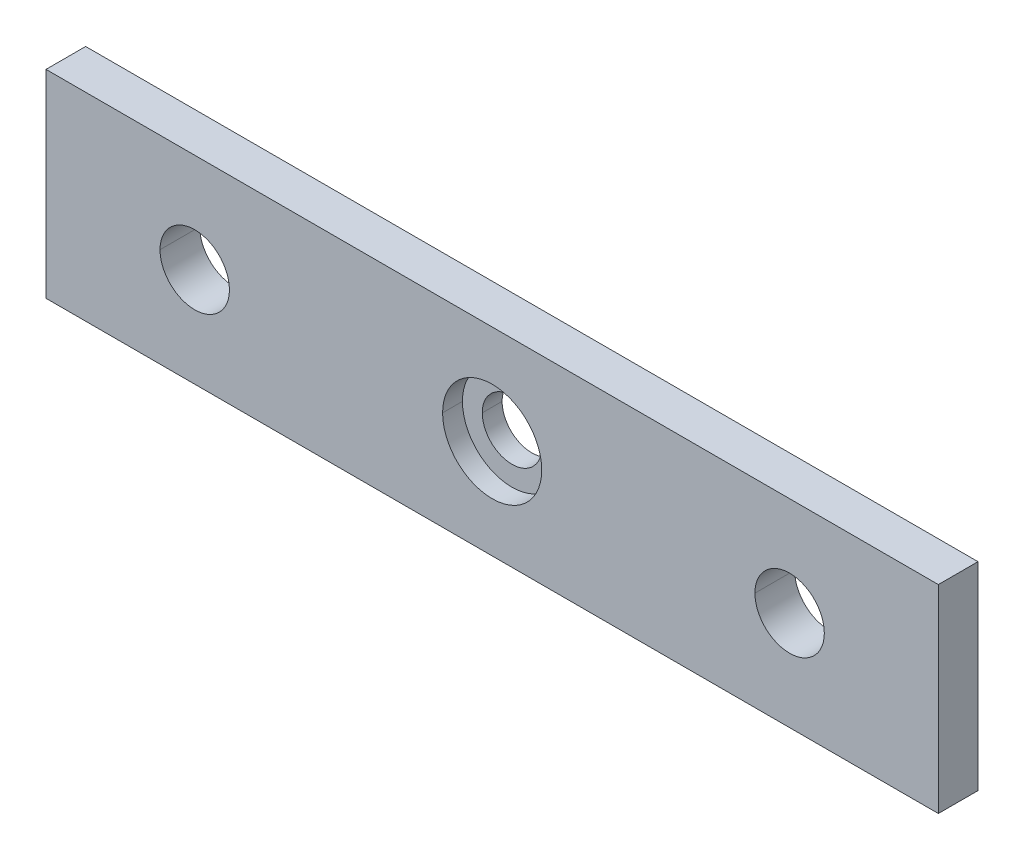
ISO-10303-21;
HEADER;
FILE_DESCRIPTION(('STEP AP214'),'2;1');
FILE_NAME('part.step','',(''),(''),'','','');
FILE_SCHEMA(('AUTOMOTIVE_DESIGN { 1 0 10303 214 1 1 1 1 }'));
ENDSEC;
DATA;
#1=APPLICATION_CONTEXT('core data for automotive mechanical design processes');
#2=APPLICATION_PROTOCOL_DEFINITION('international standard','automotive_design',2000,#1);
#3=PRODUCT_CONTEXT('',#1,'mechanical');
#4=PRODUCT('Part','Part','',(#3));
#5=PRODUCT_RELATED_PRODUCT_CATEGORY('part','',(#4));
#6=PRODUCT_DEFINITION_FORMATION('','',#4);
#7=PRODUCT_DEFINITION_CONTEXT('part definition',#1,'design');
#8=PRODUCT_DEFINITION('design','',#6,#7);
#9=PRODUCT_DEFINITION_SHAPE('','',#8);
#10=(LENGTH_UNIT() NAMED_UNIT(*) SI_UNIT(.MILLI.,.METRE.));
#11=(NAMED_UNIT(*) PLANE_ANGLE_UNIT() SI_UNIT($,.RADIAN.));
#12=(NAMED_UNIT(*) SI_UNIT($,.STERADIAN.) SOLID_ANGLE_UNIT());
#13=UNCERTAINTY_MEASURE_WITH_UNIT(LENGTH_MEASURE(1.E-05),#10,'distance_accuracy_value','');
#14=(GEOMETRIC_REPRESENTATION_CONTEXT(3) GLOBAL_UNCERTAINTY_ASSIGNED_CONTEXT((#13)) GLOBAL_UNIT_ASSIGNED_CONTEXT((#10,
#11,#12)) REPRESENTATION_CONTEXT('',''));
#15=CARTESIAN_POINT('',(0.,0.,0.));
#16=DIRECTION('',(0.,0.,1.));
#17=DIRECTION('',(1.,0.,0.));
#18=AXIS2_PLACEMENT_3D('',#15,#16,#17);
#19=CARTESIAN_POINT('',(22.5,5.,1.));
#20=DIRECTION('',(0.,0.,-1.));
#21=DIRECTION('',(-1.,0.,0.));
#22=AXIS2_PLACEMENT_3D('',#19,#20,#21);
#23=CYLINDRICAL_SURFACE('',#22,1.5);
#24=DIRECTION('',(0.,0.,-1.));
#25=VECTOR('',#24,1.);
#26=CARTESIAN_POINT('',(24.,5.,1.));
#27=LINE('',#26,#25);
#28=CARTESIAN_POINT('',(24.,5.,1.));
#29=VERTEX_POINT('',#28);
#30=CARTESIAN_POINT('',(24.,5.,0.));
#31=VERTEX_POINT('',#30);
#32=EDGE_CURVE('E213',#29,#31,#27,.T.);
#33=ORIENTED_EDGE('',*,*,#32,.F.);
#34=CARTESIAN_POINT('',(22.5,5.,1.));
#35=DIRECTION('',(0.,0.,-1.));
#36=DIRECTION('',(-1.,0.,0.));
#37=AXIS2_PLACEMENT_3D('',#34,#35,#36);
#38=CIRCLE('',#37,1.5);
#39=CARTESIAN_POINT('',(21.,5.,1.));
#40=VERTEX_POINT('',#39);
#41=EDGE_CURVE('E11',#40,#29,#38,.T.);
#42=ORIENTED_EDGE('',*,*,#41,.F.);
#43=DIRECTION('',(0.,0.,-1.));
#44=VECTOR('',#43,1.);
#45=CARTESIAN_POINT('',(21.,5.,1.));
#46=LINE('',#45,#44);
#47=CARTESIAN_POINT('',(21.,5.,0.));
#48=VERTEX_POINT('',#47);
#49=EDGE_CURVE('E216',#40,#48,#46,.T.);
#50=ORIENTED_EDGE('',*,*,#49,.T.);
#51=CARTESIAN_POINT('',(22.5,5.,0.));
#52=DIRECTION('',(0.,0.,-1.));
#53=DIRECTION('',(-1.,0.,0.));
#54=AXIS2_PLACEMENT_3D('',#51,#52,#53);
#55=CIRCLE('',#54,1.5);
#56=EDGE_CURVE('E21',#48,#31,#55,.T.);
#57=ORIENTED_EDGE('',*,*,#56,.T.);
#58=EDGE_LOOP('',(#33,#42,#50,#57));
#59=FACE_BOUND('',#58,.T.);
#60=ADVANCED_FACE('F17',(#59),#23,.F.);
#61=CARTESIAN_POINT('',(22.5,5.,1.));
#62=DIRECTION('',(0.,0.,-1.));
#63=DIRECTION('',(0.,-1.,0.));
#64=AXIS2_PLACEMENT_3D('',#61,#62,#63);
#65=PLANE('',#64);
#66=ORIENTED_EDGE('',*,*,#41,.T.);
#67=CARTESIAN_POINT('',(22.5,5.,1.));
#68=DIRECTION('',(0.,0.,-1.));
#69=DIRECTION('',(-1.,0.,0.));
#70=AXIS2_PLACEMENT_3D('',#67,#68,#69);
#71=CIRCLE('',#70,1.5);
#72=EDGE_CURVE('E209',#29,#40,#71,.T.);
#73=ORIENTED_EDGE('',*,*,#72,.T.);
#74=EDGE_LOOP('',(#66,#73));
#75=FACE_BOUND('',#74,.T.);
#76=CARTESIAN_POINT('',(22.5,5.,1.));
#77=DIRECTION('',(0.,0.,-1.));
#78=DIRECTION('',(-1.,0.,0.));
#79=AXIS2_PLACEMENT_3D('',#76,#77,#78);
#80=CIRCLE('',#79,2.5);
#81=CARTESIAN_POINT('',(20.,5.,1.));
#82=VERTEX_POINT('',#81);
#83=CARTESIAN_POINT('',(25.,5.,1.));
#84=VERTEX_POINT('',#83);
#85=EDGE_CURVE('E169',#82,#84,#80,.T.);
#86=ORIENTED_EDGE('',*,*,#85,.F.);
#87=CARTESIAN_POINT('',(22.5,5.,1.));
#88=DIRECTION('',(0.,0.,-1.));
#89=DIRECTION('',(-1.,0.,0.));
#90=AXIS2_PLACEMENT_3D('',#87,#88,#89);
#91=CIRCLE('',#90,2.5);
#92=EDGE_CURVE('E192',#84,#82,#91,.T.);
#93=ORIENTED_EDGE('',*,*,#92,.F.);
#94=EDGE_LOOP('',(#86,#93));
#95=FACE_BOUND('',#94,.T.);
#96=ADVANCED_FACE('F296',(#75,#95),#65,.F.);
#97=CARTESIAN_POINT('',(37.5,5.,2.));
#98=DIRECTION('',(0.,0.,-1.));
#99=DIRECTION('',(-1.,0.,0.));
#100=AXIS2_PLACEMENT_3D('',#97,#98,#99);
#101=CYLINDRICAL_SURFACE('',#100,1.75);
#102=DIRECTION('',(0.,0.,-1.));
#103=VECTOR('',#102,1.);
#104=CARTESIAN_POINT('',(39.25,5.,2.));
#105=LINE('',#104,#103);
#106=CARTESIAN_POINT('',(39.25,5.,2.));
#107=VERTEX_POINT('',#106);
#108=CARTESIAN_POINT('',(39.25,5.,0.));
#109=VERTEX_POINT('',#108);
#110=EDGE_CURVE('E147',#107,#109,#105,.T.);
#111=ORIENTED_EDGE('',*,*,#110,.F.);
#112=CARTESIAN_POINT('',(37.5,5.,2.));
#113=DIRECTION('',(0.,0.,1.));
#114=DIRECTION('',(1.,0.,0.));
#115=AXIS2_PLACEMENT_3D('',#112,#113,#114);
#116=CIRCLE('',#115,1.75);
#117=CARTESIAN_POINT('',(35.75,5.,2.));
#118=VERTEX_POINT('',#117);
#119=EDGE_CURVE('E139',#107,#118,#116,.T.);
#120=ORIENTED_EDGE('',*,*,#119,.T.);
#121=DIRECTION('',(0.,0.,-1.));
#122=VECTOR('',#121,1.);
#123=CARTESIAN_POINT('',(35.75,5.,2.));
#124=LINE('',#123,#122);
#125=CARTESIAN_POINT('',(35.75,5.,0.));
#126=VERTEX_POINT('',#125);
#127=EDGE_CURVE('E137',#118,#126,#124,.T.);
#128=ORIENTED_EDGE('',*,*,#127,.T.);
#129=CARTESIAN_POINT('',(37.5,5.,0.));
#130=DIRECTION('',(0.,0.,1.));
#131=DIRECTION('',(1.,0.,0.));
#132=AXIS2_PLACEMENT_3D('',#129,#130,#131);
#133=CIRCLE('',#132,1.75);
#134=EDGE_CURVE('E124',#109,#126,#133,.T.);
#135=ORIENTED_EDGE('',*,*,#134,.F.);
#136=EDGE_LOOP('',(#111,#120,#128,#135));
#137=FACE_BOUND('',#136,.T.);
#138=ADVANCED_FACE('F138',(#137),#101,.F.);
#139=CARTESIAN_POINT('',(7.5,5.,2.));
#140=DIRECTION('',(0.,0.,-1.));
#141=DIRECTION('',(-1.,0.,0.));
#142=AXIS2_PLACEMENT_3D('',#139,#140,#141);
#143=CYLINDRICAL_SURFACE('',#142,1.75);
#144=DIRECTION('',(0.,0.,-1.));
#145=VECTOR('',#144,1.);
#146=CARTESIAN_POINT('',(9.25,5.,2.));
#147=LINE('',#146,#145);
#148=CARTESIAN_POINT('',(9.25,5.,2.));
#149=VERTEX_POINT('',#148);
#150=CARTESIAN_POINT('',(9.25,5.,0.));
#151=VERTEX_POINT('',#150);
#152=EDGE_CURVE('E226',#149,#151,#147,.T.);
#153=ORIENTED_EDGE('',*,*,#152,.F.);
#154=CARTESIAN_POINT('',(7.5,5.,2.));
#155=DIRECTION('',(0.,0.,1.));
#156=DIRECTION('',(1.,0.,0.));
#157=AXIS2_PLACEMENT_3D('',#154,#155,#156);
#158=CIRCLE('',#157,1.75);
#159=CARTESIAN_POINT('',(5.75,5.,2.));
#160=VERTEX_POINT('',#159);
#161=EDGE_CURVE('E200',#149,#160,#158,.T.);
#162=ORIENTED_EDGE('',*,*,#161,.T.);
#163=DIRECTION('',(0.,0.,-1.));
#164=VECTOR('',#163,1.);
#165=CARTESIAN_POINT('',(5.75,5.,2.));
#166=LINE('',#165,#164);
#167=CARTESIAN_POINT('',(5.75,5.,0.));
#168=VERTEX_POINT('',#167);
#169=EDGE_CURVE('E181',#160,#168,#166,.T.);
#170=ORIENTED_EDGE('',*,*,#169,.T.);
#171=CARTESIAN_POINT('',(7.5,5.,0.));
#172=DIRECTION('',(0.,0.,1.));
#173=DIRECTION('',(1.,0.,0.));
#174=AXIS2_PLACEMENT_3D('',#171,#172,#173);
#175=CIRCLE('',#174,1.75);
#176=EDGE_CURVE('E134',#151,#168,#175,.T.);
#177=ORIENTED_EDGE('',*,*,#176,.F.);
#178=EDGE_LOOP('',(#153,#162,#170,#177));
#179=FACE_BOUND('',#178,.T.);
#180=ADVANCED_FACE('F268',(#179),#143,.F.);
#181=CARTESIAN_POINT('',(0.,10.,2.));
#182=DIRECTION('',(0.,-1.,0.));
#183=DIRECTION('',(0.,0.,-1.));
#184=AXIS2_PLACEMENT_3D('',#181,#182,#183);
#185=PLANE('',#184);
#186=DIRECTION('',(-1.,0.,0.));
#187=VECTOR('',#186,1.);
#188=CARTESIAN_POINT('',(0.,10.,0.));
#189=LINE('',#188,#187);
#190=CARTESIAN_POINT('',(45.,10.,0.));
#191=VERTEX_POINT('',#190);
#192=CARTESIAN_POINT('',(0.,10.,0.));
#193=VERTEX_POINT('',#192);
#194=EDGE_CURVE('E162',#191,#193,#189,.T.);
#195=ORIENTED_EDGE('',*,*,#194,.T.);
#196=DIRECTION('',(0.,0.,-1.));
#197=VECTOR('',#196,1.);
#198=CARTESIAN_POINT('',(0.,10.,2.));
#199=LINE('',#198,#197);
#200=CARTESIAN_POINT('',(0.,10.,2.));
#201=VERTEX_POINT('',#200);
#202=EDGE_CURVE('E191',#201,#193,#199,.T.);
#203=ORIENTED_EDGE('',*,*,#202,.F.);
#204=DIRECTION('',(-1.,0.,0.));
#205=VECTOR('',#204,1.);
#206=CARTESIAN_POINT('',(0.,10.,2.));
#207=LINE('',#206,#205);
#208=CARTESIAN_POINT('',(45.,10.,2.));
#209=VERTEX_POINT('',#208);
#210=EDGE_CURVE('E167',#209,#201,#207,.T.);
#211=ORIENTED_EDGE('',*,*,#210,.F.);
#212=DIRECTION('',(0.,0.,-1.));
#213=VECTOR('',#212,1.);
#214=CARTESIAN_POINT('',(45.,10.,2.));
#215=LINE('',#214,#213);
#216=EDGE_CURVE('E28',#209,#191,#215,.T.);
#217=ORIENTED_EDGE('',*,*,#216,.T.);
#218=EDGE_LOOP('',(#195,#203,#211,#217));
#219=FACE_BOUND('',#218,.T.);
#220=ADVANCED_FACE('F287',(#219),#185,.F.);
#221=CARTESIAN_POINT('',(45.,0.,2.));
#222=DIRECTION('',(-1.,0.,0.));
#223=DIRECTION('',(0.,0.,1.));
#224=AXIS2_PLACEMENT_3D('',#221,#222,#223);
#225=PLANE('',#224);
#226=DIRECTION('',(0.,1.,0.));
#227=VECTOR('',#226,1.);
#228=CARTESIAN_POINT('',(45.,0.,0.));
#229=LINE('',#228,#227);
#230=CARTESIAN_POINT('',(45.,0.,0.));
#231=VERTEX_POINT('',#230);
#232=EDGE_CURVE('E158',#231,#191,#229,.T.);
#233=ORIENTED_EDGE('',*,*,#232,.T.);
#234=ORIENTED_EDGE('',*,*,#216,.F.);
#235=DIRECTION('',(0.,1.,0.));
#236=VECTOR('',#235,1.);
#237=CARTESIAN_POINT('',(45.,0.,2.));
#238=LINE('',#237,#236);
#239=CARTESIAN_POINT('',(45.,0.,2.));
#240=VERTEX_POINT('',#239);
#241=EDGE_CURVE('E163',#240,#209,#238,.T.);
#242=ORIENTED_EDGE('',*,*,#241,.F.);
#243=DIRECTION('',(0.,0.,-1.));
#244=VECTOR('',#243,1.);
#245=CARTESIAN_POINT('',(45.,0.,2.));
#246=LINE('',#245,#244);
#247=EDGE_CURVE('E43',#240,#231,#246,.T.);
#248=ORIENTED_EDGE('',*,*,#247,.T.);
#249=EDGE_LOOP('',(#233,#234,#242,#248));
#250=FACE_BOUND('',#249,.T.);
#251=ADVANCED_FACE('F284',(#250),#225,.F.);
#252=CARTESIAN_POINT('',(0.,0.,2.));
#253=DIRECTION('',(0.,1.,0.));
#254=DIRECTION('',(1.,0.,0.));
#255=AXIS2_PLACEMENT_3D('',#252,#253,#254);
#256=PLANE('',#255);
#257=DIRECTION('',(1.,0.,0.));
#258=VECTOR('',#257,1.);
#259=CARTESIAN_POINT('',(0.,0.,0.));
#260=LINE('',#259,#258);
#261=CARTESIAN_POINT('',(0.,0.,0.));
#262=VERTEX_POINT('',#261);
#263=EDGE_CURVE('E161',#262,#231,#260,.T.);
#264=ORIENTED_EDGE('',*,*,#263,.T.);
#265=ORIENTED_EDGE('',*,*,#247,.F.);
#266=DIRECTION('',(1.,0.,0.));
#267=VECTOR('',#266,1.);
#268=CARTESIAN_POINT('',(0.,0.,2.));
#269=LINE('',#268,#267);
#270=CARTESIAN_POINT('',(0.,0.,2.));
#271=VERTEX_POINT('',#270);
#272=EDGE_CURVE('E168',#271,#240,#269,.T.);
#273=ORIENTED_EDGE('',*,*,#272,.F.);
#274=DIRECTION('',(0.,0.,-1.));
#275=VECTOR('',#274,1.);
#276=CARTESIAN_POINT('',(0.,0.,2.));
#277=LINE('',#276,#275);
#278=EDGE_CURVE('E221',#271,#262,#277,.T.);
#279=ORIENTED_EDGE('',*,*,#278,.T.);
#280=EDGE_LOOP('',(#264,#265,#273,#279));
#281=FACE_BOUND('',#280,.T.);
#282=ADVANCED_FACE('F282',(#281),#256,.F.);
#283=CARTESIAN_POINT('',(0.,0.,2.));
#284=DIRECTION('',(1.,0.,0.));
#285=DIRECTION('',(0.,1.,0.));
#286=AXIS2_PLACEMENT_3D('',#283,#284,#285);
#287=PLANE('',#286);
#288=DIRECTION('',(0.,-1.,0.));
#289=VECTOR('',#288,1.);
#290=CARTESIAN_POINT('',(0.,0.,0.));
#291=LINE('',#290,#289);
#292=EDGE_CURVE('E180',#193,#262,#291,.T.);
#293=ORIENTED_EDGE('',*,*,#292,.T.);
#294=ORIENTED_EDGE('',*,*,#278,.F.);
#295=DIRECTION('',(0.,-1.,0.));
#296=VECTOR('',#295,1.);
#297=CARTESIAN_POINT('',(0.,0.,2.));
#298=LINE('',#297,#296);
#299=EDGE_CURVE('E172',#201,#271,#298,.T.);
#300=ORIENTED_EDGE('',*,*,#299,.F.);
#301=ORIENTED_EDGE('',*,*,#202,.T.);
#302=EDGE_LOOP('',(#293,#294,#300,#301));
#303=FACE_BOUND('',#302,.T.);
#304=ADVANCED_FACE('F278',(#303),#287,.F.);
#305=CARTESIAN_POINT('',(0.,0.,0.));
#306=DIRECTION('',(0.,0.,-1.));
#307=DIRECTION('',(0.,-1.,0.));
#308=AXIS2_PLACEMENT_3D('',#305,#306,#307);
#309=PLANE('',#308);
#310=ORIENTED_EDGE('',*,*,#56,.F.);
#311=CARTESIAN_POINT('',(22.5,5.,0.));
#312=DIRECTION('',(0.,0.,-1.));
#313=DIRECTION('',(-1.,0.,0.));
#314=AXIS2_PLACEMENT_3D('',#311,#312,#313);
#315=CIRCLE('',#314,1.5);
#316=EDGE_CURVE('E220',#31,#48,#315,.T.);
#317=ORIENTED_EDGE('',*,*,#316,.F.);
#318=EDGE_LOOP('',(#310,#317));
#319=FACE_BOUND('',#318,.T.);
#320=CARTESIAN_POINT('',(37.5,5.,0.));
#321=DIRECTION('',(0.,0.,1.));
#322=DIRECTION('',(1.,0.,0.));
#323=AXIS2_PLACEMENT_3D('',#320,#321,#322);
#324=CIRCLE('',#323,1.75);
#325=EDGE_CURVE('E129',#126,#109,#324,.T.);
#326=ORIENTED_EDGE('',*,*,#325,.T.);
#327=ORIENTED_EDGE('',*,*,#134,.T.);
#328=EDGE_LOOP('',(#326,#327));
#329=FACE_BOUND('',#328,.T.);
#330=CARTESIAN_POINT('',(7.5,5.,0.));
#331=DIRECTION('',(0.,0.,1.));
#332=DIRECTION('',(1.,0.,0.));
#333=AXIS2_PLACEMENT_3D('',#330,#331,#332);
#334=CIRCLE('',#333,1.75);
#335=EDGE_CURVE('E186',#168,#151,#334,.T.);
#336=ORIENTED_EDGE('',*,*,#335,.T.);
#337=ORIENTED_EDGE('',*,*,#176,.T.);
#338=EDGE_LOOP('',(#336,#337));
#339=FACE_BOUND('',#338,.T.);
#340=ORIENTED_EDGE('',*,*,#292,.F.);
#341=ORIENTED_EDGE('',*,*,#194,.F.);
#342=ORIENTED_EDGE('',*,*,#232,.F.);
#343=ORIENTED_EDGE('',*,*,#263,.F.);
#344=EDGE_LOOP('',(#340,#341,#342,#343));
#345=FACE_BOUND('',#344,.T.);
#346=ADVANCED_FACE('F126',(#319,#329,#339,#345),#309,.T.);
#347=CARTESIAN_POINT('',(0.,0.,2.));
#348=DIRECTION('',(0.,0.,-1.));
#349=DIRECTION('',(0.,-1.,0.));
#350=AXIS2_PLACEMENT_3D('',#347,#348,#349);
#351=PLANE('',#350);
#352=CARTESIAN_POINT('',(37.5,5.,2.));
#353=DIRECTION('',(0.,0.,1.));
#354=DIRECTION('',(1.,0.,0.));
#355=AXIS2_PLACEMENT_3D('',#352,#353,#354);
#356=CIRCLE('',#355,1.75);
#357=EDGE_CURVE('E154',#118,#107,#356,.T.);
#358=ORIENTED_EDGE('',*,*,#357,.F.);
#359=ORIENTED_EDGE('',*,*,#119,.F.);
#360=EDGE_LOOP('',(#358,#359));
#361=FACE_BOUND('',#360,.T.);
#362=CARTESIAN_POINT('',(22.5,5.,2.));
#363=DIRECTION('',(0.,0.,1.));
#364=DIRECTION('',(1.,0.,0.));
#365=AXIS2_PLACEMENT_3D('',#362,#363,#364);
#366=CIRCLE('',#365,2.5);
#367=CARTESIAN_POINT('',(20.,5.,2.));
#368=VERTEX_POINT('',#367);
#369=CARTESIAN_POINT('',(25.,5.,2.));
#370=VERTEX_POINT('',#369);
#371=EDGE_CURVE('E185',#368,#370,#366,.T.);
#372=ORIENTED_EDGE('',*,*,#371,.F.);
#373=CARTESIAN_POINT('',(22.5,5.,2.));
#374=DIRECTION('',(0.,0.,1.));
#375=DIRECTION('',(1.,0.,0.));
#376=AXIS2_PLACEMENT_3D('',#373,#374,#375);
#377=CIRCLE('',#376,2.5);
#378=EDGE_CURVE('E173',#370,#368,#377,.T.);
#379=ORIENTED_EDGE('',*,*,#378,.F.);
#380=EDGE_LOOP('',(#372,#379));
#381=FACE_BOUND('',#380,.T.);
#382=CARTESIAN_POINT('',(7.5,5.,2.));
#383=DIRECTION('',(0.,0.,1.));
#384=DIRECTION('',(1.,0.,0.));
#385=AXIS2_PLACEMENT_3D('',#382,#383,#384);
#386=CIRCLE('',#385,1.75);
#387=EDGE_CURVE('E144',#160,#149,#386,.T.);
#388=ORIENTED_EDGE('',*,*,#387,.F.);
#389=ORIENTED_EDGE('',*,*,#161,.F.);
#390=EDGE_LOOP('',(#388,#389));
#391=FACE_BOUND('',#390,.T.);
#392=ORIENTED_EDGE('',*,*,#299,.T.);
#393=ORIENTED_EDGE('',*,*,#272,.T.);
#394=ORIENTED_EDGE('',*,*,#241,.T.);
#395=ORIENTED_EDGE('',*,*,#210,.T.);
#396=EDGE_LOOP('',(#392,#393,#394,#395));
#397=FACE_BOUND('',#396,.T.);
#398=ADVANCED_FACE('F19',(#361,#381,#391,#397),#351,.F.);
#399=CARTESIAN_POINT('',(22.5,5.,2.));
#400=DIRECTION('',(0.,0.,-1.));
#401=DIRECTION('',(-1.,0.,0.));
#402=AXIS2_PLACEMENT_3D('',#399,#400,#401);
#403=CYLINDRICAL_SURFACE('',#402,2.5);
#404=DIRECTION('',(0.,0.,-1.));
#405=VECTOR('',#404,1.);
#406=CARTESIAN_POINT('',(25.,5.,2.));
#407=LINE('',#406,#405);
#408=EDGE_CURVE('E197',#370,#84,#407,.T.);
#409=ORIENTED_EDGE('',*,*,#408,.F.);
#410=ORIENTED_EDGE('',*,*,#378,.T.);
#411=DIRECTION('',(0.,0.,-1.));
#412=VECTOR('',#411,1.);
#413=CARTESIAN_POINT('',(20.,5.,2.));
#414=LINE('',#413,#412);
#415=EDGE_CURVE('E196',#368,#82,#414,.T.);
#416=ORIENTED_EDGE('',*,*,#415,.T.);
#417=ORIENTED_EDGE('',*,*,#85,.T.);
#418=EDGE_LOOP('',(#409,#410,#416,#417));
#419=FACE_BOUND('',#418,.T.);
#420=ADVANCED_FACE('F272',(#419),#403,.F.);
#421=CARTESIAN_POINT('',(22.5,5.,2.));
#422=DIRECTION('',(0.,0.,-1.));
#423=DIRECTION('',(-1.,0.,0.));
#424=AXIS2_PLACEMENT_3D('',#421,#422,#423);
#425=CYLINDRICAL_SURFACE('',#424,2.5);
#426=ORIENTED_EDGE('',*,*,#371,.T.);
#427=ORIENTED_EDGE('',*,*,#408,.T.);
#428=ORIENTED_EDGE('',*,*,#92,.T.);
#429=ORIENTED_EDGE('',*,*,#415,.F.);
#430=EDGE_LOOP('',(#426,#427,#428,#429));
#431=FACE_BOUND('',#430,.T.);
#432=ADVANCED_FACE('F312',(#431),#425,.F.);
#433=CARTESIAN_POINT('',(7.5,5.,2.));
#434=DIRECTION('',(0.,0.,-1.));
#435=DIRECTION('',(-1.,0.,0.));
#436=AXIS2_PLACEMENT_3D('',#433,#434,#435);
#437=CYLINDRICAL_SURFACE('',#436,1.75);
#438=ORIENTED_EDGE('',*,*,#387,.T.);
#439=ORIENTED_EDGE('',*,*,#152,.T.);
#440=ORIENTED_EDGE('',*,*,#335,.F.);
#441=ORIENTED_EDGE('',*,*,#169,.F.);
#442=EDGE_LOOP('',(#438,#439,#440,#441));
#443=FACE_BOUND('',#442,.T.);
#444=ADVANCED_FACE('F265',(#443),#437,.F.);
#445=CARTESIAN_POINT('',(37.5,5.,2.));
#446=DIRECTION('',(0.,0.,-1.));
#447=DIRECTION('',(-1.,0.,0.));
#448=AXIS2_PLACEMENT_3D('',#445,#446,#447);
#449=CYLINDRICAL_SURFACE('',#448,1.75);
#450=ORIENTED_EDGE('',*,*,#357,.T.);
#451=ORIENTED_EDGE('',*,*,#110,.T.);
#452=ORIENTED_EDGE('',*,*,#325,.F.);
#453=ORIENTED_EDGE('',*,*,#127,.F.);
#454=EDGE_LOOP('',(#450,#451,#452,#453));
#455=FACE_BOUND('',#454,.T.);
#456=ADVANCED_FACE('F146',(#455),#449,.F.);
#457=CARTESIAN_POINT('',(22.5,5.,1.));
#458=DIRECTION('',(0.,0.,-1.));
#459=DIRECTION('',(-1.,0.,0.));
#460=AXIS2_PLACEMENT_3D('',#457,#458,#459);
#461=CYLINDRICAL_SURFACE('',#460,1.5);
#462=ORIENTED_EDGE('',*,*,#72,.F.);
#463=ORIENTED_EDGE('',*,*,#32,.T.);
#464=ORIENTED_EDGE('',*,*,#316,.T.);
#465=ORIENTED_EDGE('',*,*,#49,.F.);
#466=EDGE_LOOP('',(#462,#463,#464,#465));
#467=FACE_BOUND('',#466,.T.);
#468=ADVANCED_FACE('F308',(#467),#461,.F.);
#469=CLOSED_SHELL('',(#60,#96,#138,#180,#220,#251,#282,#304,#346,#398,#420,#432,#444,#456,#468));
#470=MANIFOLD_SOLID_BREP('B1',#469);
#471=ADVANCED_BREP_SHAPE_REPRESENTATION('',(#18,#470),#14);
#472=SHAPE_DEFINITION_REPRESENTATION(#9,#471);
ENDSEC;
END-ISO-10303-21;
